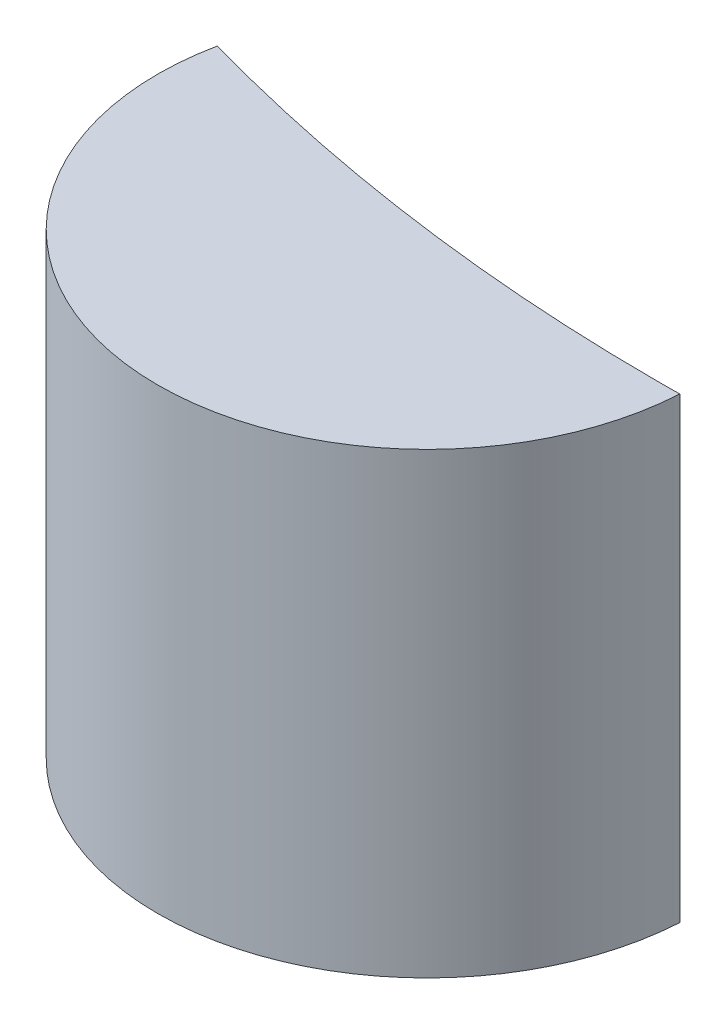
ISO-10303-21;
HEADER;
FILE_DESCRIPTION(('STEP AP214'),'2;1');
FILE_NAME('part.step','',(''),(''),'','','');
FILE_SCHEMA(('AUTOMOTIVE_DESIGN { 1 0 10303 214 1 1 1 1 }'));
ENDSEC;
DATA;
#1=APPLICATION_CONTEXT('core data for automotive mechanical design processes');
#2=APPLICATION_PROTOCOL_DEFINITION('international standard','automotive_design',2000,#1);
#3=PRODUCT_CONTEXT('',#1,'mechanical');
#4=PRODUCT('Part','Part','',(#3));
#5=PRODUCT_RELATED_PRODUCT_CATEGORY('part','',(#4));
#6=PRODUCT_DEFINITION_FORMATION('','',#4);
#7=PRODUCT_DEFINITION_CONTEXT('part definition',#1,'design');
#8=PRODUCT_DEFINITION('design','',#6,#7);
#9=PRODUCT_DEFINITION_SHAPE('','',#8);
#10=(LENGTH_UNIT() NAMED_UNIT(*) SI_UNIT(.MILLI.,.METRE.));
#11=(NAMED_UNIT(*) PLANE_ANGLE_UNIT() SI_UNIT($,.RADIAN.));
#12=(NAMED_UNIT(*) SI_UNIT($,.STERADIAN.) SOLID_ANGLE_UNIT());
#13=UNCERTAINTY_MEASURE_WITH_UNIT(LENGTH_MEASURE(1.E-05),#10,'distance_accuracy_value','');
#14=(GEOMETRIC_REPRESENTATION_CONTEXT(3) GLOBAL_UNCERTAINTY_ASSIGNED_CONTEXT((#13)) GLOBAL_UNIT_ASSIGNED_CONTEXT((#10,
#11,#12)) REPRESENTATION_CONTEXT('',''));
#15=CARTESIAN_POINT('',(0.,0.,0.));
#16=DIRECTION('',(0.,0.,1.));
#17=DIRECTION('',(1.,0.,0.));
#18=AXIS2_PLACEMENT_3D('',#15,#16,#17);
#19=CARTESIAN_POINT('',(0.,1.7,0.));
#20=DIRECTION('',(0.,-1.,0.));
#21=DIRECTION('',(0.,0.,-1.));
#22=AXIS2_PLACEMENT_3D('',#19,#20,#21);
#23=CYLINDRICAL_SURFACE('',#22,7.);
#24=DIRECTION('',(0.,-1.,0.));
#25=VECTOR('',#24,1.);
#26=CARTESIAN_POINT('',(-1.89327247712385,1.7,6.73910374807847));
#27=LINE('',#26,#25);
#28=CARTESIAN_POINT('',(-1.89327247712365,1.7,6.73910374807853));
#29=VERTEX_POINT('',#28);
#30=CARTESIAN_POINT('',(-1.89327247712365,0.,6.73910374807853));
#31=VERTEX_POINT('',#30);
#32=EDGE_CURVE('E34',#29,#31,#27,.T.);
#33=ORIENTED_EDGE('',*,*,#32,.F.);
#34=CARTESIAN_POINT('',(0.,1.7,0.));
#35=DIRECTION('',(0.,-1.,0.));
#36=DIRECTION('',(0.,0.,-1.));
#37=AXIS2_PLACEMENT_3D('',#34,#35,#36);
#38=CIRCLE('',#37,7.);
#39=CARTESIAN_POINT('',(0.,1.7,7.));
#40=VERTEX_POINT('',#39);
#41=EDGE_CURVE('E53',#29,#40,#38,.F.);
#42=ORIENTED_EDGE('',*,*,#41,.T.);
#43=CARTESIAN_POINT('',(0.,1.7,0.));
#44=DIRECTION('',(0.,-1.,0.));
#45=DIRECTION('',(0.,0.,-1.));
#46=AXIS2_PLACEMENT_3D('',#43,#44,#45);
#47=CIRCLE('',#46,7.);
#48=CARTESIAN_POINT('',(0.0845362458841143,1.7,6.99954868512645));
#49=VERTEX_POINT('',#48);
#50=EDGE_CURVE('E56',#40,#49,#47,.F.);
#51=ORIENTED_EDGE('',*,*,#50,.T.);
#52=DIRECTION('',(0.,-1.,0.));
#53=VECTOR('',#52,1.);
#54=CARTESIAN_POINT('',(0.0845523849315167,0.,6.99948933095854));
#55=LINE('',#54,#53);
#56=CARTESIAN_POINT('',(0.0845362458841143,0.,6.99954868512645));
#57=VERTEX_POINT('',#56);
#58=EDGE_CURVE('E65',#57,#49,#55,.F.);
#59=ORIENTED_EDGE('',*,*,#58,.F.);
#60=CARTESIAN_POINT('',(0.,0.,0.));
#61=DIRECTION('',(0.,-1.,0.));
#62=DIRECTION('',(0.,0.,-1.));
#63=AXIS2_PLACEMENT_3D('',#60,#61,#62);
#64=CIRCLE('',#63,7.);
#65=CARTESIAN_POINT('',(0.,0.,7.));
#66=VERTEX_POINT('',#65);
#67=EDGE_CURVE('E46',#66,#57,#64,.F.);
#68=ORIENTED_EDGE('',*,*,#67,.F.);
#69=CARTESIAN_POINT('',(0.,0.,0.));
#70=DIRECTION('',(0.,-1.,0.));
#71=DIRECTION('',(0.,0.,-1.));
#72=AXIS2_PLACEMENT_3D('',#69,#70,#71);
#73=CIRCLE('',#72,7.);
#74=EDGE_CURVE('E79',#31,#66,#73,.F.);
#75=ORIENTED_EDGE('',*,*,#74,.F.);
#76=EDGE_LOOP('',(#33,#42,#51,#59,#68,#75));
#77=FACE_BOUND('',#76,.T.);
#78=ADVANCED_FACE('F17',(#77),#23,.F.);
#79=CARTESIAN_POINT('',(0.,1.7,-15.54142135624));
#80=DIRECTION('',(0.,-1.,0.));
#81=DIRECTION('',(0.,0.,-1.));
#82=AXIS2_PLACEMENT_3D('',#79,#80,#81);
#83=PLANE('',#82);
#84=CARTESIAN_POINT('',(-0.9136833455403,1.7,6.940114029617));
#85=DIRECTION('',(0.,-1.,0.));
#86=DIRECTION('',(0.,0.,-1.));
#87=AXIS2_PLACEMENT_3D('',#84,#85,#86);
#88=CIRCLE('',#87,1.);
#89=CARTESIAN_POINT('',(-0.9136833455403,1.7,7.940114029617));
#90=VERTEX_POINT('',#89);
#91=EDGE_CURVE('E26',#90,#29,#88,.T.);
#92=ORIENTED_EDGE('',*,*,#91,.F.);
#93=CARTESIAN_POINT('',(-0.9136833455403,1.7,6.940114029617));
#94=DIRECTION('',(0.,-1.,0.));
#95=DIRECTION('',(0.,0.,-1.));
#96=AXIS2_PLACEMENT_3D('',#93,#94,#95);
#97=CIRCLE('',#96,1.);
#98=EDGE_CURVE('E63',#49,#90,#97,.T.);
#99=ORIENTED_EDGE('',*,*,#98,.F.);
#100=ORIENTED_EDGE('',*,*,#50,.F.);
#101=ORIENTED_EDGE('',*,*,#41,.F.);
#102=EDGE_LOOP('',(#92,#99,#100,#101));
#103=FACE_BOUND('',#102,.T.);
#104=ADVANCED_FACE('F61',(#103),#83,.F.);
#105=CARTESIAN_POINT('',(0.,0.,-15.54142135624));
#106=DIRECTION('',(0.,-1.,0.));
#107=DIRECTION('',(0.,0.,-1.));
#108=AXIS2_PLACEMENT_3D('',#105,#106,#107);
#109=PLANE('',#108);
#110=CARTESIAN_POINT('',(-0.9136833455403,0.,6.940114029617));
#111=DIRECTION('',(0.,-1.,0.));
#112=DIRECTION('',(0.,0.,-1.));
#113=AXIS2_PLACEMENT_3D('',#110,#111,#112);
#114=CIRCLE('',#113,1.);
#115=CARTESIAN_POINT('',(-0.9136833455403,0.,7.940114029617));
#116=VERTEX_POINT('',#115);
#117=EDGE_CURVE('E11',#31,#116,#114,.F.);
#118=ORIENTED_EDGE('',*,*,#117,.F.);
#119=ORIENTED_EDGE('',*,*,#74,.T.);
#120=ORIENTED_EDGE('',*,*,#67,.T.);
#121=CARTESIAN_POINT('',(-0.9136833455403,0.,6.940114029617));
#122=DIRECTION('',(0.,-1.,0.));
#123=DIRECTION('',(0.,0.,-1.));
#124=AXIS2_PLACEMENT_3D('',#121,#122,#123);
#125=CIRCLE('',#124,1.);
#126=EDGE_CURVE('E73',#116,#57,#125,.F.);
#127=ORIENTED_EDGE('',*,*,#126,.F.);
#128=EDGE_LOOP('',(#118,#119,#120,#127));
#129=FACE_BOUND('',#128,.T.);
#130=ADVANCED_FACE('F78',(#129),#109,.T.);
#131=CARTESIAN_POINT('',(-0.9136833455403,1.7,6.940114029617));
#132=DIRECTION('',(0.,-1.,0.));
#133=DIRECTION('',(0.,0.,-1.));
#134=AXIS2_PLACEMENT_3D('',#131,#132,#133);
#135=CYLINDRICAL_SURFACE('',#134,1.);
#136=ORIENTED_EDGE('',*,*,#32,.T.);
#137=ORIENTED_EDGE('',*,*,#117,.T.);
#138=ORIENTED_EDGE('',*,*,#126,.T.);
#139=ORIENTED_EDGE('',*,*,#58,.T.);
#140=ORIENTED_EDGE('',*,*,#98,.T.);
#141=ORIENTED_EDGE('',*,*,#91,.T.);
#142=EDGE_LOOP('',(#136,#137,#138,#139,#140,#141));
#143=FACE_BOUND('',#142,.T.);
#144=ADVANCED_FACE('F72',(#143),#135,.T.);
#145=CLOSED_SHELL('',(#78,#104,#130,#144));
#146=MANIFOLD_SOLID_BREP('B1',#145);
#147=ADVANCED_BREP_SHAPE_REPRESENTATION('',(#18,#146),#14);
#148=SHAPE_DEFINITION_REPRESENTATION(#9,#147);
ENDSEC;
END-ISO-10303-21;
